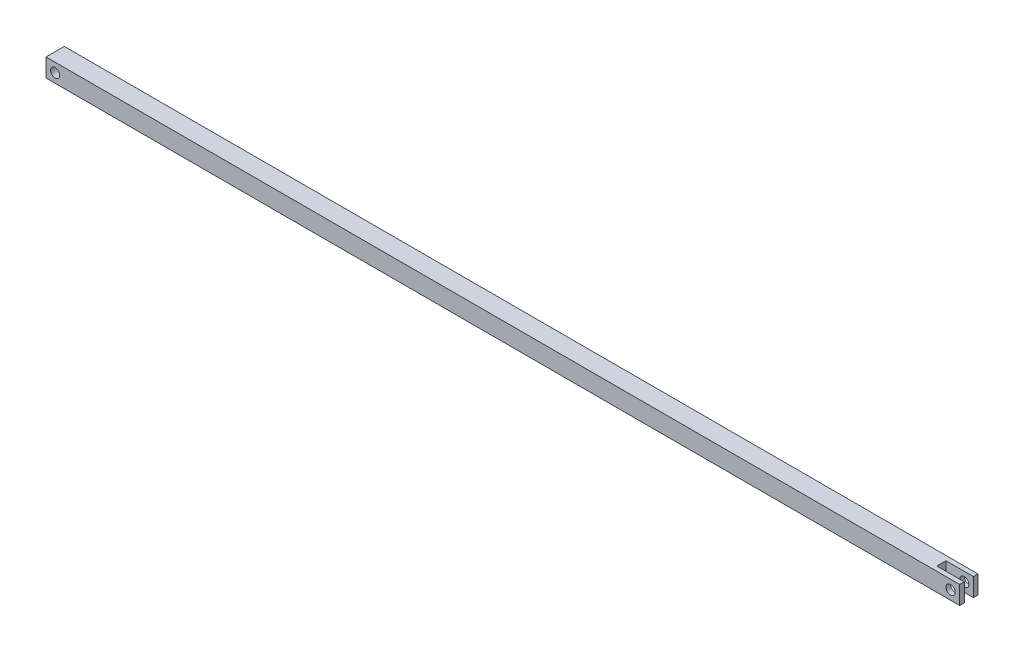
ISO-10303-21;
HEADER;
FILE_DESCRIPTION(('STEP AP214'),'2;1');
FILE_NAME('part.step','',(''),(''),'','','');
FILE_SCHEMA(('AUTOMOTIVE_DESIGN { 1 0 10303 214 1 1 1 1 }'));
ENDSEC;
DATA;
#1=APPLICATION_CONTEXT('core data for automotive mechanical design processes');
#2=APPLICATION_PROTOCOL_DEFINITION('international standard','automotive_design',2000,#1);
#3=PRODUCT_CONTEXT('',#1,'mechanical');
#4=PRODUCT('Part','Part','',(#3));
#5=PRODUCT_RELATED_PRODUCT_CATEGORY('part','',(#4));
#6=PRODUCT_DEFINITION_FORMATION('','',#4);
#7=PRODUCT_DEFINITION_CONTEXT('part definition',#1,'design');
#8=PRODUCT_DEFINITION('design','',#6,#7);
#9=PRODUCT_DEFINITION_SHAPE('','',#8);
#10=(LENGTH_UNIT() NAMED_UNIT(*) SI_UNIT(.MILLI.,.METRE.));
#11=(NAMED_UNIT(*) PLANE_ANGLE_UNIT() SI_UNIT($,.RADIAN.));
#12=(NAMED_UNIT(*) SI_UNIT($,.STERADIAN.) SOLID_ANGLE_UNIT());
#13=UNCERTAINTY_MEASURE_WITH_UNIT(LENGTH_MEASURE(1.E-05),#10,'distance_accuracy_value','');
#14=(GEOMETRIC_REPRESENTATION_CONTEXT(3) GLOBAL_UNCERTAINTY_ASSIGNED_CONTEXT((#13)) GLOBAL_UNIT_ASSIGNED_CONTEXT((#10,
#11,#12)) REPRESENTATION_CONTEXT('',''));
#15=CARTESIAN_POINT('',(0.,0.,0.));
#16=DIRECTION('',(0.,0.,1.));
#17=DIRECTION('',(1.,0.,0.));
#18=AXIS2_PLACEMENT_3D('',#15,#16,#17);
#19=CARTESIAN_POINT('',(500.,-9.99999999999994,20.));
#20=DIRECTION('',(-1.,0.,0.));
#21=DIRECTION('',(0.,-1.,0.));
#22=AXIS2_PLACEMENT_3D('',#19,#20,#21);
#23=PLANE('',#22);
#24=DIRECTION('',(0.,-1.,0.));
#25=VECTOR('',#24,1.);
#26=CARTESIAN_POINT('',(500.,1260.49990003998,15.));
#27=LINE('',#26,#25);
#28=CARTESIAN_POINT('',(500.,10.0000000000001,15.));
#29=VERTEX_POINT('',#28);
#30=CARTESIAN_POINT('',(500.,-9.99999999999994,15.));
#31=VERTEX_POINT('',#30);
#32=EDGE_CURVE('E123',#29,#31,#27,.T.);
#33=ORIENTED_EDGE('',*,*,#32,.F.);
#34=DIRECTION('',(0.,0.,-1.));
#35=VECTOR('',#34,1.);
#36=CARTESIAN_POINT('',(500.,10.0000000000001,20.));
#37=LINE('',#36,#35);
#38=CARTESIAN_POINT('',(500.,10.0000000000001,20.));
#39=VERTEX_POINT('',#38);
#40=EDGE_CURVE('E11',#39,#29,#37,.T.);
#41=ORIENTED_EDGE('',*,*,#40,.F.);
#42=DIRECTION('',(0.,1.,0.));
#43=VECTOR('',#42,1.);
#44=CARTESIAN_POINT('',(500.,-9.99999999999994,20.));
#45=LINE('',#44,#43);
#46=CARTESIAN_POINT('',(500.,-9.99999999999994,20.));
#47=VERTEX_POINT('',#46);
#48=EDGE_CURVE('E155',#47,#39,#45,.T.);
#49=ORIENTED_EDGE('',*,*,#48,.F.);
#50=DIRECTION('',(0.,0.,-1.));
#51=VECTOR('',#50,1.);
#52=CARTESIAN_POINT('',(500.,-9.99999999999994,20.));
#53=LINE('',#52,#51);
#54=EDGE_CURVE('E182',#47,#31,#53,.T.);
#55=ORIENTED_EDGE('',*,*,#54,.T.);
#56=EDGE_LOOP('',(#33,#41,#49,#55));
#57=FACE_BOUND('',#56,.T.);
#58=ADVANCED_FACE('F39',(#57),#23,.F.);
#59=DIRECTION('',(0.,-1.,0.));
#60=VECTOR('',#59,1.);
#61=CARTESIAN_POINT('',(500.,1260.49990003998,5.));
#62=LINE('',#61,#60);
#63=CARTESIAN_POINT('',(500.,10.0000000000001,5.));
#64=VERTEX_POINT('',#63);
#65=CARTESIAN_POINT('',(500.,-9.99999999999994,5.));
#66=VERTEX_POINT('',#65);
#67=EDGE_CURVE('E125',#64,#66,#62,.T.);
#68=ORIENTED_EDGE('',*,*,#67,.T.);
#69=CARTESIAN_POINT('',(500.,-9.99999999999994,0.));
#70=VERTEX_POINT('',#69);
#71=EDGE_CURVE('E169',#66,#70,#53,.T.);
#72=ORIENTED_EDGE('',*,*,#71,.T.);
#73=DIRECTION('',(0.,1.,0.));
#74=VECTOR('',#73,1.);
#75=CARTESIAN_POINT('',(500.,-9.99999999999994,0.));
#76=LINE('',#75,#74);
#77=CARTESIAN_POINT('',(500.,10.0000000000001,0.));
#78=VERTEX_POINT('',#77);
#79=EDGE_CURVE('E151',#70,#78,#76,.T.);
#80=ORIENTED_EDGE('',*,*,#79,.T.);
#81=EDGE_CURVE('E48',#64,#78,#37,.T.);
#82=ORIENTED_EDGE('',*,*,#81,.F.);
#83=EDGE_LOOP('',(#68,#72,#80,#82));
#84=FACE_BOUND('',#83,.T.);
#85=ADVANCED_FACE('F208',(#84),#23,.F.);
#86=CARTESIAN_POINT('',(-500.,9.99999999999994,20.));
#87=DIRECTION('',(0.,-1.,0.));
#88=DIRECTION('',(1.,0.,0.));
#89=AXIS2_PLACEMENT_3D('',#86,#87,#88);
#90=PLANE('',#89);
#91=DIRECTION('',(-1.,0.,0.));
#92=VECTOR('',#91,1.);
#93=CARTESIAN_POINT('',(470.,10.0000000000002,15.));
#94=LINE('',#93,#92);
#95=CARTESIAN_POINT('',(470.,10.0000000000001,15.));
#96=VERTEX_POINT('',#95);
#97=EDGE_CURVE('E55',#29,#96,#94,.T.);
#98=ORIENTED_EDGE('',*,*,#97,.T.);
#99=DIRECTION('',(0.,0.,-1.));
#100=VECTOR('',#99,1.);
#101=CARTESIAN_POINT('',(470.,10.0000000000002,5.));
#102=LINE('',#101,#100);
#103=CARTESIAN_POINT('',(470.,10.0000000000001,5.));
#104=VERTEX_POINT('',#103);
#105=EDGE_CURVE('E59',#96,#104,#102,.T.);
#106=ORIENTED_EDGE('',*,*,#105,.T.);
#107=DIRECTION('',(1.,0.,0.));
#108=VECTOR('',#107,1.);
#109=CARTESIAN_POINT('',(500.,10.0000000000002,5.));
#110=LINE('',#109,#108);
#111=EDGE_CURVE('E200',#104,#64,#110,.T.);
#112=ORIENTED_EDGE('',*,*,#111,.T.);
#113=ORIENTED_EDGE('',*,*,#81,.T.);
#114=DIRECTION('',(-1.,0.,0.));
#115=VECTOR('',#114,1.);
#116=CARTESIAN_POINT('',(-500.,9.99999999999994,0.));
#117=LINE('',#116,#115);
#118=CARTESIAN_POINT('',(-500.,9.99999999999994,0.));
#119=VERTEX_POINT('',#118);
#120=EDGE_CURVE('E173',#78,#119,#117,.T.);
#121=ORIENTED_EDGE('',*,*,#120,.T.);
#122=DIRECTION('',(0.,0.,-1.));
#123=VECTOR('',#122,1.);
#124=CARTESIAN_POINT('',(-500.,9.99999999999994,20.));
#125=LINE('',#124,#123);
#126=CARTESIAN_POINT('',(-500.,9.99999999999994,20.));
#127=VERTEX_POINT('',#126);
#128=EDGE_CURVE('E189',#127,#119,#125,.T.);
#129=ORIENTED_EDGE('',*,*,#128,.F.);
#130=DIRECTION('',(-1.,0.,0.));
#131=VECTOR('',#130,1.);
#132=CARTESIAN_POINT('',(-500.,9.99999999999994,20.));
#133=LINE('',#132,#131);
#134=EDGE_CURVE('E159',#39,#127,#133,.T.);
#135=ORIENTED_EDGE('',*,*,#134,.F.);
#136=ORIENTED_EDGE('',*,*,#40,.T.);
#137=EDGE_LOOP('',(#98,#106,#112,#113,#121,#129,#135,#136));
#138=FACE_BOUND('',#137,.T.);
#139=ADVANCED_FACE('F199',(#138),#90,.F.);
#140=CARTESIAN_POINT('',(-500.,-10.0000000000001,20.));
#141=DIRECTION('',(0.,1.,0.));
#142=DIRECTION('',(-1.,0.,0.));
#143=AXIS2_PLACEMENT_3D('',#140,#141,#142);
#144=PLANE('',#143);
#145=DIRECTION('',(1.,0.,0.));
#146=VECTOR('',#145,1.);
#147=CARTESIAN_POINT('',(500.,-9.99999999999979,5.));
#148=LINE('',#147,#146);
#149=CARTESIAN_POINT('',(470.,-9.99999999999986,5.));
#150=VERTEX_POINT('',#149);
#151=EDGE_CURVE('E111',#150,#66,#148,.T.);
#152=ORIENTED_EDGE('',*,*,#151,.F.);
#153=DIRECTION('',(0.,0.,-1.));
#154=VECTOR('',#153,1.);
#155=CARTESIAN_POINT('',(470.,-9.99999999999979,5.));
#156=LINE('',#155,#154);
#157=CARTESIAN_POINT('',(470.,-9.99999999999986,15.));
#158=VERTEX_POINT('',#157);
#159=EDGE_CURVE('E103',#158,#150,#156,.T.);
#160=ORIENTED_EDGE('',*,*,#159,.F.);
#161=DIRECTION('',(-1.,0.,0.));
#162=VECTOR('',#161,1.);
#163=CARTESIAN_POINT('',(470.,-9.99999999999979,15.));
#164=LINE('',#163,#162);
#165=EDGE_CURVE('E107',#31,#158,#164,.T.);
#166=ORIENTED_EDGE('',*,*,#165,.F.);
#167=ORIENTED_EDGE('',*,*,#54,.F.);
#168=DIRECTION('',(1.,0.,0.));
#169=VECTOR('',#168,1.);
#170=CARTESIAN_POINT('',(-500.,-10.0000000000001,20.));
#171=LINE('',#170,#169);
#172=CARTESIAN_POINT('',(-500.,-10.0000000000001,20.));
#173=VERTEX_POINT('',#172);
#174=EDGE_CURVE('E166',#173,#47,#171,.T.);
#175=ORIENTED_EDGE('',*,*,#174,.F.);
#176=DIRECTION('',(0.,0.,-1.));
#177=VECTOR('',#176,1.);
#178=CARTESIAN_POINT('',(-500.,-10.0000000000001,20.));
#179=LINE('',#178,#177);
#180=CARTESIAN_POINT('',(-500.,-10.0000000000001,0.));
#181=VERTEX_POINT('',#180);
#182=EDGE_CURVE('E185',#173,#181,#179,.T.);
#183=ORIENTED_EDGE('',*,*,#182,.T.);
#184=DIRECTION('',(1.,0.,0.));
#185=VECTOR('',#184,1.);
#186=CARTESIAN_POINT('',(-500.,-10.0000000000001,0.));
#187=LINE('',#186,#185);
#188=EDGE_CURVE('E160',#181,#70,#187,.T.);
#189=ORIENTED_EDGE('',*,*,#188,.T.);
#190=ORIENTED_EDGE('',*,*,#71,.F.);
#191=EDGE_LOOP('',(#152,#160,#166,#167,#175,#183,#189,#190));
#192=FACE_BOUND('',#191,.T.);
#193=ADVANCED_FACE('F105',(#192),#144,.F.);
#194=CARTESIAN_POINT('',(490.,0.,20.));
#195=DIRECTION('',(0.,0.,-1.));
#196=DIRECTION('',(-1.,0.,0.));
#197=AXIS2_PLACEMENT_3D('',#194,#195,#196);
#198=CYLINDRICAL_SURFACE('',#197,4.99999999999999);
#199=CARTESIAN_POINT('',(490.,0.,20.));
#200=DIRECTION('',(0.,0.,1.));
#201=DIRECTION('',(-1.,0.,0.));
#202=AXIS2_PLACEMENT_3D('',#199,#200,#201);
#203=CIRCLE('',#202,4.99999999999999);
#204=CARTESIAN_POINT('',(485.,0.,20.));
#205=VERTEX_POINT('',#204);
#206=EDGE_CURVE('E138',#205,#205,#203,.T.);
#207=ORIENTED_EDGE('',*,*,#206,.T.);
#208=EDGE_LOOP('',(#207));
#209=FACE_BOUND('',#208,.T.);
#210=CARTESIAN_POINT('',(490.,0.,15.));
#211=DIRECTION('',(0.,0.,-1.));
#212=DIRECTION('',(-1.,0.,0.));
#213=AXIS2_PLACEMENT_3D('',#210,#211,#212);
#214=CIRCLE('',#213,4.99999999999999);
#215=CARTESIAN_POINT('',(485.,0.,15.));
#216=VERTEX_POINT('',#215);
#217=EDGE_CURVE('E42',#216,#216,#214,.T.);
#218=ORIENTED_EDGE('',*,*,#217,.T.);
#219=EDGE_LOOP('',(#218));
#220=FACE_BOUND('',#219,.T.);
#221=ADVANCED_FACE('F250',(#209,#220),#198,.F.);
#222=CARTESIAN_POINT('',(490.,0.,0.));
#223=DIRECTION('',(0.,0.,1.));
#224=DIRECTION('',(-1.,0.,0.));
#225=AXIS2_PLACEMENT_3D('',#222,#223,#224);
#226=CIRCLE('',#225,4.99999999999999);
#227=CARTESIAN_POINT('',(485.,0.,0.));
#228=VERTEX_POINT('',#227);
#229=EDGE_CURVE('E143',#228,#228,#226,.T.);
#230=ORIENTED_EDGE('',*,*,#229,.F.);
#231=EDGE_LOOP('',(#230));
#232=FACE_BOUND('',#231,.T.);
#233=CARTESIAN_POINT('',(490.,0.,5.));
#234=DIRECTION('',(0.,0.,1.));
#235=DIRECTION('',(1.,0.,0.));
#236=AXIS2_PLACEMENT_3D('',#233,#234,#235);
#237=CIRCLE('',#236,4.99999999999999);
#238=CARTESIAN_POINT('',(495.,0.,5.));
#239=VERTEX_POINT('',#238);
#240=EDGE_CURVE('E129',#239,#239,#237,.T.);
#241=ORIENTED_EDGE('',*,*,#240,.T.);
#242=EDGE_LOOP('',(#241));
#243=FACE_BOUND('',#242,.T.);
#244=ADVANCED_FACE('F261',(#232,#243),#198,.F.);
#245=CARTESIAN_POINT('',(0.,0.,20.));
#246=DIRECTION('',(0.,0.,-1.));
#247=DIRECTION('',(-1.,0.,0.));
#248=AXIS2_PLACEMENT_3D('',#245,#246,#247);
#249=PLANE('',#248);
#250=ORIENTED_EDGE('',*,*,#48,.T.);
#251=ORIENTED_EDGE('',*,*,#134,.T.);
#252=DIRECTION('',(0.,-1.,0.));
#253=VECTOR('',#252,1.);
#254=CARTESIAN_POINT('',(-500.,-10.0000000000001,20.));
#255=LINE('',#254,#253);
#256=EDGE_CURVE('E163',#127,#173,#255,.T.);
#257=ORIENTED_EDGE('',*,*,#256,.T.);
#258=ORIENTED_EDGE('',*,*,#174,.T.);
#259=EDGE_LOOP('',(#250,#251,#257,#258));
#260=FACE_BOUND('',#259,.T.);
#261=CARTESIAN_POINT('',(-490.,0.,20.));
#262=DIRECTION('',(0.,0.,1.));
#263=DIRECTION('',(1.,0.,0.));
#264=AXIS2_PLACEMENT_3D('',#261,#262,#263);
#265=CIRCLE('',#264,4.99999999999999);
#266=CARTESIAN_POINT('',(-485.,0.,20.));
#267=VERTEX_POINT('',#266);
#268=EDGE_CURVE('E147',#267,#267,#265,.T.);
#269=ORIENTED_EDGE('',*,*,#268,.F.);
#270=EDGE_LOOP('',(#269));
#271=FACE_BOUND('',#270,.T.);
#272=ORIENTED_EDGE('',*,*,#206,.F.);
#273=EDGE_LOOP('',(#272));
#274=FACE_BOUND('',#273,.T.);
#275=ADVANCED_FACE('F214',(#260,#271,#274),#249,.F.);
#276=CARTESIAN_POINT('',(0.,0.,0.));
#277=DIRECTION('',(0.,0.,-1.));
#278=DIRECTION('',(-1.,0.,0.));
#279=AXIS2_PLACEMENT_3D('',#276,#277,#278);
#280=PLANE('',#279);
#281=CARTESIAN_POINT('',(-490.,0.,0.));
#282=DIRECTION('',(0.,0.,1.));
#283=DIRECTION('',(1.,0.,0.));
#284=AXIS2_PLACEMENT_3D('',#281,#282,#283);
#285=CIRCLE('',#284,4.99999999999999);
#286=CARTESIAN_POINT('',(-485.,0.,0.));
#287=VERTEX_POINT('',#286);
#288=EDGE_CURVE('E142',#287,#287,#285,.T.);
#289=ORIENTED_EDGE('',*,*,#288,.T.);
#290=EDGE_LOOP('',(#289));
#291=FACE_BOUND('',#290,.T.);
#292=ORIENTED_EDGE('',*,*,#79,.F.);
#293=ORIENTED_EDGE('',*,*,#188,.F.);
#294=DIRECTION('',(0.,-1.,0.));
#295=VECTOR('',#294,1.);
#296=CARTESIAN_POINT('',(-500.,-10.0000000000001,0.));
#297=LINE('',#296,#295);
#298=EDGE_CURVE('E176',#119,#181,#297,.T.);
#299=ORIENTED_EDGE('',*,*,#298,.F.);
#300=ORIENTED_EDGE('',*,*,#120,.F.);
#301=EDGE_LOOP('',(#292,#293,#299,#300));
#302=FACE_BOUND('',#301,.T.);
#303=ORIENTED_EDGE('',*,*,#229,.T.);
#304=EDGE_LOOP('',(#303));
#305=FACE_BOUND('',#304,.T.);
#306=ADVANCED_FACE('F205',(#291,#302,#305),#280,.T.);
#307=CARTESIAN_POINT('',(-500.,-10.0000000000001,20.));
#308=DIRECTION('',(1.,0.,0.));
#309=DIRECTION('',(0.,0.,-1.));
#310=AXIS2_PLACEMENT_3D('',#307,#308,#309);
#311=PLANE('',#310);
#312=ORIENTED_EDGE('',*,*,#298,.T.);
#313=ORIENTED_EDGE('',*,*,#182,.F.);
#314=ORIENTED_EDGE('',*,*,#256,.F.);
#315=ORIENTED_EDGE('',*,*,#128,.T.);
#316=EDGE_LOOP('',(#312,#313,#314,#315));
#317=FACE_BOUND('',#316,.T.);
#318=ADVANCED_FACE('F212',(#317),#311,.F.);
#319=CARTESIAN_POINT('',(-490.,0.,20.));
#320=DIRECTION('',(0.,0.,-1.));
#321=DIRECTION('',(-1.,0.,0.));
#322=AXIS2_PLACEMENT_3D('',#319,#320,#321);
#323=CYLINDRICAL_SURFACE('',#322,4.99999999999999);
#324=ORIENTED_EDGE('',*,*,#268,.T.);
#325=EDGE_LOOP('',(#324));
#326=FACE_BOUND('',#325,.T.);
#327=ORIENTED_EDGE('',*,*,#288,.F.);
#328=EDGE_LOOP('',(#327));
#329=FACE_BOUND('',#328,.T.);
#330=ADVANCED_FACE('F254',(#326,#329),#323,.F.);
#331=CARTESIAN_POINT('',(470.,1260.49990003998,15.));
#332=DIRECTION('',(0.,0.,-1.));
#333=DIRECTION('',(-1.,0.,0.));
#334=AXIS2_PLACEMENT_3D('',#331,#332,#333);
#335=PLANE('',#334);
#336=ORIENTED_EDGE('',*,*,#217,.F.);
#337=EDGE_LOOP('',(#336));
#338=FACE_BOUND('',#337,.T.);
#339=ORIENTED_EDGE('',*,*,#97,.F.);
#340=ORIENTED_EDGE('',*,*,#32,.T.);
#341=ORIENTED_EDGE('',*,*,#165,.T.);
#342=DIRECTION('',(0.,-1.,0.));
#343=VECTOR('',#342,1.);
#344=CARTESIAN_POINT('',(470.,1260.49990003998,15.));
#345=LINE('',#344,#343);
#346=EDGE_CURVE('E122',#96,#158,#345,.T.);
#347=ORIENTED_EDGE('',*,*,#346,.F.);
#348=EDGE_LOOP('',(#339,#340,#341,#347));
#349=FACE_BOUND('',#348,.T.);
#350=ADVANCED_FACE('F121',(#338,#349),#335,.T.);
#351=CARTESIAN_POINT('',(470.,1260.49990003998,5.));
#352=DIRECTION('',(1.,0.,0.));
#353=DIRECTION('',(0.,0.,-1.));
#354=AXIS2_PLACEMENT_3D('',#351,#352,#353);
#355=PLANE('',#354);
#356=ORIENTED_EDGE('',*,*,#105,.F.);
#357=ORIENTED_EDGE('',*,*,#346,.T.);
#358=ORIENTED_EDGE('',*,*,#159,.T.);
#359=DIRECTION('',(0.,-1.,0.));
#360=VECTOR('',#359,1.);
#361=CARTESIAN_POINT('',(470.,1260.49990003998,5.));
#362=LINE('',#361,#360);
#363=EDGE_CURVE('E134',#104,#150,#362,.T.);
#364=ORIENTED_EDGE('',*,*,#363,.F.);
#365=EDGE_LOOP('',(#356,#357,#358,#364));
#366=FACE_BOUND('',#365,.T.);
#367=ADVANCED_FACE('F127',(#366),#355,.T.);
#368=CARTESIAN_POINT('',(500.,1260.49990003998,5.));
#369=DIRECTION('',(0.,0.,1.));
#370=DIRECTION('',(1.,0.,0.));
#371=AXIS2_PLACEMENT_3D('',#368,#369,#370);
#372=PLANE('',#371);
#373=ORIENTED_EDGE('',*,*,#240,.F.);
#374=EDGE_LOOP('',(#373));
#375=FACE_BOUND('',#374,.T.);
#376=ORIENTED_EDGE('',*,*,#111,.F.);
#377=ORIENTED_EDGE('',*,*,#363,.T.);
#378=ORIENTED_EDGE('',*,*,#151,.T.);
#379=ORIENTED_EDGE('',*,*,#67,.F.);
#380=EDGE_LOOP('',(#376,#377,#378,#379));
#381=FACE_BOUND('',#380,.T.);
#382=ADVANCED_FACE('F230',(#375,#381),#372,.T.);
#383=CLOSED_SHELL('',(#58,#85,#139,#193,#221,#244,#275,#306,#318,#330,#350,#367,#382));
#384=MANIFOLD_SOLID_BREP('B2',#383);
#385=ADVANCED_BREP_SHAPE_REPRESENTATION('',(#18,#384),#14);
#386=SHAPE_DEFINITION_REPRESENTATION(#9,#385);
ENDSEC;
END-ISO-10303-21;
